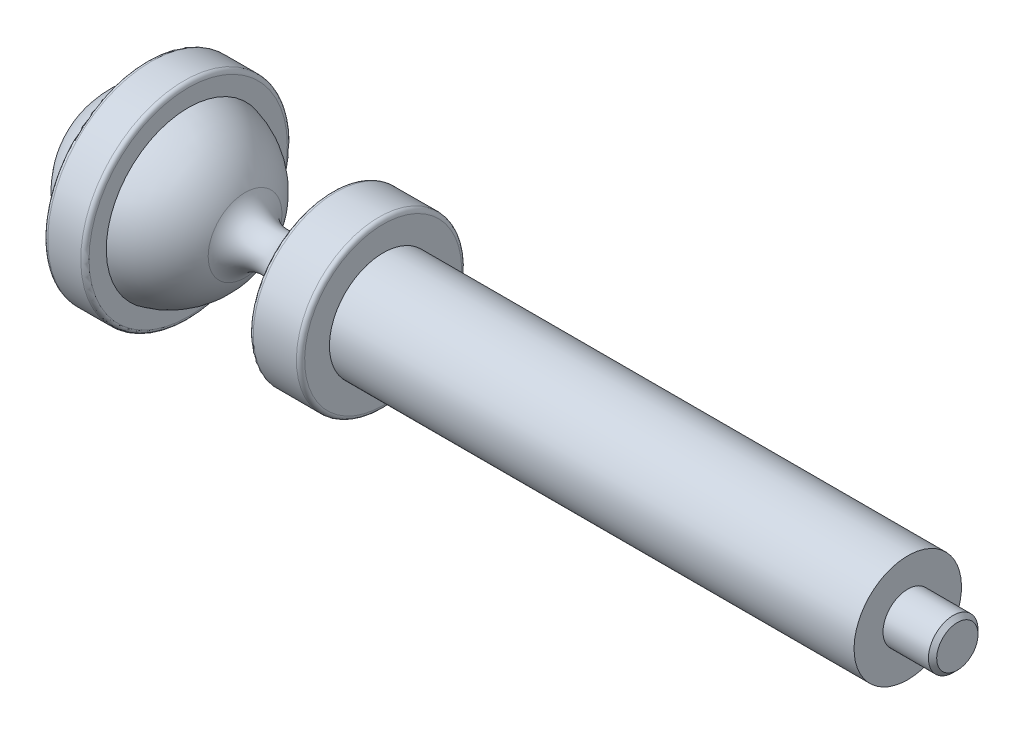
ISO-10303-21;
HEADER;
FILE_DESCRIPTION(('STEP AP214'),'2;1');
FILE_NAME('part.step','',(''),(''),'','','');
FILE_SCHEMA(('AUTOMOTIVE_DESIGN { 1 0 10303 214 1 1 1 1 }'));
ENDSEC;
DATA;
#1=APPLICATION_CONTEXT('core data for automotive mechanical design processes');
#2=APPLICATION_PROTOCOL_DEFINITION('international standard','automotive_design',2000,#1);
#3=PRODUCT_CONTEXT('',#1,'mechanical');
#4=PRODUCT('Part','Part','',(#3));
#5=PRODUCT_RELATED_PRODUCT_CATEGORY('part','',(#4));
#6=PRODUCT_DEFINITION_FORMATION('','',#4);
#7=PRODUCT_DEFINITION_CONTEXT('part definition',#1,'design');
#8=PRODUCT_DEFINITION('design','',#6,#7);
#9=PRODUCT_DEFINITION_SHAPE('','',#8);
#10=(LENGTH_UNIT() NAMED_UNIT(*) SI_UNIT(.MILLI.,.METRE.));
#11=(NAMED_UNIT(*) PLANE_ANGLE_UNIT() SI_UNIT($,.RADIAN.));
#12=(NAMED_UNIT(*) SI_UNIT($,.STERADIAN.) SOLID_ANGLE_UNIT());
#13=UNCERTAINTY_MEASURE_WITH_UNIT(LENGTH_MEASURE(1.E-05),#10,'distance_accuracy_value','');
#14=(GEOMETRIC_REPRESENTATION_CONTEXT(3) GLOBAL_UNCERTAINTY_ASSIGNED_CONTEXT((#13)) GLOBAL_UNIT_ASSIGNED_CONTEXT((#10,
#11,#12)) REPRESENTATION_CONTEXT('',''));
#15=CARTESIAN_POINT('',(0.,0.,0.));
#16=DIRECTION('',(0.,0.,1.));
#17=DIRECTION('',(1.,0.,0.));
#18=AXIS2_PLACEMENT_3D('',#15,#16,#17);
#19=CARTESIAN_POINT('',(10.16,0.,0.));
#20=DIRECTION('',(-1.,0.,0.));
#21=DIRECTION('',(0.,1.,0.));
#22=AXIS2_PLACEMENT_3D('',#19,#20,#21);
#23=SPHERICAL_SURFACE('',#22,10.16);
#24=CARTESIAN_POINT('',(7.4,0.,0.));
#25=DIRECTION('',(-1.,0.,0.));
#26=DIRECTION('',(0.,-1.,0.));
#27=AXIS2_PLACEMENT_3D('',#24,#25,#26);
#28=CIRCLE('',#27,9.77793434218087);
#29=CARTESIAN_POINT('',(7.4,-9.77793434218087,0.));
#30=VERTEX_POINT('',#29);
#31=EDGE_CURVE('E95',#30,#30,#28,.T.);
#32=ORIENTED_EDGE('',*,*,#31,.T.);
#33=EDGE_LOOP('',(#32));
#34=FACE_BOUND('',#33,.T.);
#35=ADVANCED_FACE('F39',(#34),#23,.T.);
#36=CARTESIAN_POINT('',(105.5,0.,0.));
#37=DIRECTION('',(-1.,0.,0.));
#38=DIRECTION('',(0.,-1.,0.));
#39=AXIS2_PLACEMENT_3D('',#36,#37,#38);
#40=PLANE('',#39);
#41=CARTESIAN_POINT('',(105.5,0.,0.));
#42=DIRECTION('',(-1.,0.,0.));
#43=DIRECTION('',(0.,-1.,0.));
#44=AXIS2_PLACEMENT_3D('',#41,#42,#43);
#45=CIRCLE('',#44,2.5);
#46=CARTESIAN_POINT('',(105.5,-2.5,0.));
#47=VERTEX_POINT('',#46);
#48=EDGE_CURVE('E71',#47,#47,#45,.T.);
#49=ORIENTED_EDGE('',*,*,#48,.F.);
#50=EDGE_LOOP('',(#49));
#51=FACE_BOUND('',#50,.T.);
#52=ADVANCED_FACE('F116',(#51),#40,.F.);
#53=CARTESIAN_POINT('',(105.5,0.,0.));
#54=DIRECTION('',(-1.,0.,0.));
#55=DIRECTION('',(0.,-1.,0.));
#56=AXIS2_PLACEMENT_3D('',#53,#54,#55);
#57=CONICAL_SURFACE('',#56,2.5,0.785398163397448);
#58=CARTESIAN_POINT('',(105.,0.,0.));
#59=DIRECTION('',(-1.,0.,0.));
#60=DIRECTION('',(0.,-1.,0.));
#61=AXIS2_PLACEMENT_3D('',#58,#59,#60);
#62=CIRCLE('',#61,3.);
#63=CARTESIAN_POINT('',(105.,-3.,0.));
#64=VERTEX_POINT('',#63);
#65=EDGE_CURVE('E74',#64,#64,#62,.T.);
#66=ORIENTED_EDGE('',*,*,#65,.F.);
#67=EDGE_LOOP('',(#66));
#68=FACE_BOUND('',#67,.T.);
#69=ORIENTED_EDGE('',*,*,#48,.T.);
#70=EDGE_LOOP('',(#69));
#71=FACE_BOUND('',#70,.T.);
#72=ADVANCED_FACE('F121',(#68,#71),#57,.T.);
#73=CARTESIAN_POINT('',(0.,0.,0.));
#74=DIRECTION('',(-1.,0.,0.));
#75=DIRECTION('',(0.,-1.,0.));
#76=AXIS2_PLACEMENT_3D('',#73,#74,#75);
#77=CYLINDRICAL_SURFACE('',#76,3.);
#78=CARTESIAN_POINT('',(99.5,0.,0.));
#79=DIRECTION('',(-1.,0.,0.));
#80=DIRECTION('',(0.,-1.,0.));
#81=AXIS2_PLACEMENT_3D('',#78,#79,#80);
#82=CIRCLE('',#81,3.);
#83=CARTESIAN_POINT('',(99.5,-3.,0.));
#84=VERTEX_POINT('',#83);
#85=EDGE_CURVE('E77',#84,#84,#82,.T.);
#86=ORIENTED_EDGE('',*,*,#85,.F.);
#87=EDGE_LOOP('',(#86));
#88=FACE_BOUND('',#87,.T.);
#89=ORIENTED_EDGE('',*,*,#65,.T.);
#90=EDGE_LOOP('',(#89));
#91=FACE_BOUND('',#90,.T.);
#92=ADVANCED_FACE('F246',(#88,#91),#77,.T.);
#93=CARTESIAN_POINT('',(99.5,3.,0.));
#94=DIRECTION('',(-1.,0.,0.));
#95=DIRECTION('',(0.,-1.,0.));
#96=AXIS2_PLACEMENT_3D('',#93,#94,#95);
#97=PLANE('',#96);
#98=CARTESIAN_POINT('',(99.5,0.,0.));
#99=DIRECTION('',(-1.,0.,0.));
#100=DIRECTION('',(0.,-1.,0.));
#101=AXIS2_PLACEMENT_3D('',#98,#99,#100);
#102=CIRCLE('',#101,6.5);
#103=CARTESIAN_POINT('',(99.5,-6.5,0.));
#104=VERTEX_POINT('',#103);
#105=EDGE_CURVE('E80',#104,#104,#102,.T.);
#106=ORIENTED_EDGE('',*,*,#105,.F.);
#107=EDGE_LOOP('',(#106));
#108=FACE_BOUND('',#107,.T.);
#109=ORIENTED_EDGE('',*,*,#85,.T.);
#110=EDGE_LOOP('',(#109));
#111=FACE_BOUND('',#110,.T.);
#112=ADVANCED_FACE('F236',(#108,#111),#97,.F.);
#113=CARTESIAN_POINT('',(0.,0.,0.));
#114=DIRECTION('',(-1.,0.,0.));
#115=DIRECTION('',(0.,-1.,0.));
#116=AXIS2_PLACEMENT_3D('',#113,#114,#115);
#117=CYLINDRICAL_SURFACE('',#116,6.5);
#118=CARTESIAN_POINT('',(36.,0.,0.));
#119=DIRECTION('',(-1.,0.,0.));
#120=DIRECTION('',(0.,-1.,0.));
#121=AXIS2_PLACEMENT_3D('',#118,#119,#120);
#122=CIRCLE('',#121,6.5);
#123=CARTESIAN_POINT('',(36.,-6.5,0.));
#124=VERTEX_POINT('',#123);
#125=EDGE_CURVE('E83',#124,#124,#122,.T.);
#126=ORIENTED_EDGE('',*,*,#125,.F.);
#127=EDGE_LOOP('',(#126));
#128=FACE_BOUND('',#127,.T.);
#129=ORIENTED_EDGE('',*,*,#105,.T.);
#130=EDGE_LOOP('',(#129));
#131=FACE_BOUND('',#130,.T.);
#132=ADVANCED_FACE('F212',(#128,#131),#117,.T.);
#133=CARTESIAN_POINT('',(36.,6.5,0.));
#134=DIRECTION('',(-1.,0.,0.));
#135=DIRECTION('',(0.,-1.,0.));
#136=AXIS2_PLACEMENT_3D('',#133,#134,#135);
#137=PLANE('',#136);
#138=CARTESIAN_POINT('',(36.,0.,0.));
#139=DIRECTION('',(-1.,0.,0.));
#140=DIRECTION('',(0.,-1.,0.));
#141=AXIS2_PLACEMENT_3D('',#138,#139,#140);
#142=CIRCLE('',#141,9.5);
#143=CARTESIAN_POINT('',(36.,-9.5,0.));
#144=VERTEX_POINT('',#143);
#145=EDGE_CURVE('E62',#144,#144,#142,.F.);
#146=ORIENTED_EDGE('',*,*,#145,.T.);
#147=EDGE_LOOP('',(#146));
#148=FACE_BOUND('',#147,.T.);
#149=ORIENTED_EDGE('',*,*,#125,.T.);
#150=EDGE_LOOP('',(#149));
#151=FACE_BOUND('',#150,.T.);
#152=ADVANCED_FACE('F202',(#148,#151),#137,.F.);
#153=CARTESIAN_POINT('',(0.,0.,0.));
#154=DIRECTION('',(-1.,0.,0.));
#155=DIRECTION('',(0.,-1.,0.));
#156=AXIS2_PLACEMENT_3D('',#153,#154,#155);
#157=CYLINDRICAL_SURFACE('',#156,10.);
#158=CARTESIAN_POINT('',(35.5,0.,0.));
#159=DIRECTION('',(-1.,0.,0.));
#160=DIRECTION('',(0.,-1.,0.));
#161=AXIS2_PLACEMENT_3D('',#158,#159,#160);
#162=CIRCLE('',#161,10.);
#163=CARTESIAN_POINT('',(35.5,-10.,0.));
#164=VERTEX_POINT('',#163);
#165=EDGE_CURVE('E65',#164,#164,#162,.T.);
#166=ORIENTED_EDGE('',*,*,#165,.T.);
#167=EDGE_LOOP('',(#166));
#168=FACE_BOUND('',#167,.T.);
#169=CARTESIAN_POINT('',(30.2754821344869,0.,0.));
#170=DIRECTION('',(1.,0.,0.));
#171=DIRECTION('',(0.,1.,0.));
#172=AXIS2_PLACEMENT_3D('',#169,#170,#171);
#173=CIRCLE('',#172,10.);
#174=CARTESIAN_POINT('',(30.2754821344869,10.,0.));
#175=VERTEX_POINT('',#174);
#176=EDGE_CURVE('E68',#175,#175,#173,.T.);
#177=ORIENTED_EDGE('',*,*,#176,.T.);
#178=EDGE_LOOP('',(#177));
#179=FACE_BOUND('',#178,.T.);
#180=ADVANCED_FACE('F190',(#168,#179),#157,.T.);
#181=CARTESIAN_POINT('',(30.,0.,0.));
#182=DIRECTION('',(1.,0.,0.));
#183=DIRECTION('',(0.,1.,0.));
#184=AXIS2_PLACEMENT_3D('',#181,#182,#183);
#185=CONICAL_SURFACE('',#184,10.,1.00716646228517);
#186=CARTESIAN_POINT('',(29.8528214346647,0.,0.));
#187=DIRECTION('',(-1.,0.,0.));
#188=DIRECTION('',(0.,-1.,0.));
#189=AXIS2_PLACEMENT_3D('',#186,#187,#188);
#190=CIRCLE('',#189,9.76712905649842);
#191=CARTESIAN_POINT('',(29.8528214346647,-9.76712905649842,0.));
#192=VERTEX_POINT('',#191);
#193=EDGE_CURVE('E59',#192,#192,#190,.T.);
#194=ORIENTED_EDGE('',*,*,#193,.T.);
#195=EDGE_LOOP('',(#194));
#196=FACE_BOUND('',#195,.T.);
#197=CARTESIAN_POINT('',(26.2612855985783,0.,0.));
#198=DIRECTION('',(-1.,0.,0.));
#199=DIRECTION('',(0.,-1.,0.));
#200=AXIS2_PLACEMENT_3D('',#197,#198,#199);
#201=CIRCLE('',#200,4.08447861848418);
#202=CARTESIAN_POINT('',(26.2612855985783,-4.08447861848418,0.));
#203=VERTEX_POINT('',#202);
#204=EDGE_CURVE('E86',#203,#203,#201,.T.);
#205=ORIENTED_EDGE('',*,*,#204,.F.);
#206=EDGE_LOOP('',(#205));
#207=FACE_BOUND('',#206,.T.);
#208=ADVANCED_FACE('F184',(#196,#207),#185,.T.);
#209=CARTESIAN_POINT('',(22.88,0.,0.));
#210=DIRECTION('',(-1.,0.,0.));
#211=DIRECTION('',(0.,-1.,0.));
#212=AXIS2_PLACEMENT_3D('',#209,#210,#211);
#213=TOROIDAL_SURFACE('',#212,6.22151107047155,4.);
#214=CARTESIAN_POINT('',(19.2867796610169,0.,0.));
#215=DIRECTION('',(-1.,0.,0.));
#216=DIRECTION('',(0.,-1.,0.));
#217=AXIS2_PLACEMENT_3D('',#214,#215,#216);
#218=CIRCLE('',#217,4.46402206751349);
#219=CARTESIAN_POINT('',(19.286779661017,4.46402206751348,0.));
#220=VERTEX_POINT('',#219);
#221=EDGE_CURVE('E89',#220,#220,#218,.T.);
#222=ORIENTED_EDGE('',*,*,#221,.F.);
#223=EDGE_LOOP('',(#222));
#224=FACE_BOUND('',#223,.T.);
#225=ORIENTED_EDGE('',*,*,#204,.T.);
#226=EDGE_LOOP('',(#225));
#227=FACE_BOUND('',#226,.T.);
#228=ADVANCED_FACE('F189',(#224,#227),#213,.F.);
#229=CARTESIAN_POINT('',(10.16,0.,0.));
#230=DIRECTION('',(-1.,0.,0.));
#231=DIRECTION('',(0.,1.,0.));
#232=AXIS2_PLACEMENT_3D('',#229,#230,#231);
#233=SPHERICAL_SURFACE('',#232,10.16);
#234=CARTESIAN_POINT('',(12.4,0.,0.));
#235=DIRECTION('',(-1.,0.,0.));
#236=DIRECTION('',(0.,-1.,0.));
#237=AXIS2_PLACEMENT_3D('',#234,#235,#236);
#238=CIRCLE('',#237,9.90999495459003);
#239=CARTESIAN_POINT('',(12.4,9.90999495459003,0.));
#240=VERTEX_POINT('',#239);
#241=EDGE_CURVE('E92',#240,#240,#238,.T.);
#242=CARTESIAN_POINT('',(12.4,9.90999495459003,0.));
#243=CARTESIAN_POINT('',(12.492245398935,9.88914469795175,0.));
#244=CARTESIAN_POINT('',(12.5841994943646,9.86700576516309,0.));
#245=CARTESIAN_POINT('',(12.7674537790401,9.82016938355329,0.));
#246=CARTESIAN_POINT('',(12.8587539682859,9.79547193473214,0.));
#247=CARTESIAN_POINT('',(13.040629141421,9.74353735732556,0.));
#248=CARTESIAN_POINT('',(13.1312041253103,9.71630022874013,0.));
#249=CARTESIAN_POINT('',(13.311558290662,9.65930764295145,0.));
#250=CARTESIAN_POINT('',(13.4013374721245,9.62955218574819,0.));
#251=CARTESIAN_POINT('',(13.5800300194723,9.56754611430478,0.));
#252=CARTESIAN_POINT('',(13.6689433853576,9.53529550006463,0.));
#253=CARTESIAN_POINT('',(13.8458349733304,9.4683242701095,0.));
#254=CARTESIAN_POINT('',(13.9338131954179,9.43360365439452,0.));
#255=CARTESIAN_POINT('',(14.1087658941254,9.36171949275429,0.));
#256=CARTESIAN_POINT('',(14.1957403707455,9.32455594682903,0.));
#257=CARTESIAN_POINT('',(14.3686177602243,9.24781490366587,0.));
#258=CARTESIAN_POINT('',(14.4545206730831,9.20823740642794,0.));
#259=CARTESIAN_POINT('',(14.6251879521102,9.12669932107984,0.));
#260=CARTESIAN_POINT('',(14.7099523182784,9.08473873296966,0.));
#261=CARTESIAN_POINT('',(14.8782764088283,8.99846718473297,0.));
#262=CARTESIAN_POINT('',(14.96183613321,8.95415622460646,0.));
#263=CARTESIAN_POINT('',(15.1276857843982,8.86321848384519,0.));
#264=CARTESIAN_POINT('',(15.2099757112048,8.81659170321042,0.));
#265=CARTESIAN_POINT('',(15.3732216015838,8.72105867871844,0.));
#266=CARTESIAN_POINT('',(15.4541775651562,8.67215243486122,0.));
#267=CARTESIAN_POINT('',(15.6146924035662,8.5720986186203,0.));
#268=CARTESIAN_POINT('',(15.6942512784037,8.52095104623658,0.));
#269=CARTESIAN_POINT('',(15.8519099032251,8.41645445531796,0.));
#270=CARTESIAN_POINT('',(15.9300096532089,8.36310543678304,0.));
#271=CARTESIAN_POINT('',(16.0846891299577,8.25424755251709,0.));
#272=CARTESIAN_POINT('',(16.1612688567228,8.19873868678604,0.));
#273=CARTESIAN_POINT('',(16.3128485739093,8.08560439122614,0.));
#274=CARTESIAN_POINT('',(16.3878485643307,8.0279789613973,0.));
#275=CARTESIAN_POINT('',(16.5362103275058,7.91065647113325,0.));
#276=CARTESIAN_POINT('',(16.6095721002594,7.85095941069807,0.));
#277=CARTESIAN_POINT('',(16.7546002241772,7.72954020806903,0.));
#278=CARTESIAN_POINT('',(16.8262665753412,7.66781806587519,0.));
#279=CARTESIAN_POINT('',(16.9678479741646,7.54239682763622,0.));
#280=CARTESIAN_POINT('',(17.0377630218238,7.4786977315911,0.));
#281=CARTESIAN_POINT('',(17.1757872973034,7.3493722550889,0.));
#282=CARTESIAN_POINT('',(17.2438965251236,7.28374587463182,0.));
#283=CARTESIAN_POINT('',(17.3782560526806,7.150617001547,0.));
#284=CARTESIAN_POINT('',(17.4445063524172,7.08311450891927,0.));
#285=CARTESIAN_POINT('',(17.5750963650647,6.94628604663544,0.));
#286=CARTESIAN_POINT('',(17.6394360779754,6.87696007697934,0.));
#287=CARTESIAN_POINT('',(17.7661547480071,6.73653871763745,0.));
#288=CARTESIAN_POINT('',(17.8285337051281,6.66544332795166,0.));
#289=CARTESIAN_POINT('',(17.9512822235312,6.52153856526304,0.));
#290=CARTESIAN_POINT('',(18.0116517848132,6.44872919226021,0.));
#291=CARTESIAN_POINT('',(18.1303344382691,6.30145323610511,0.));
#292=CARTESIAN_POINT('',(18.1886475304429,6.22698665295285,0.));
#293=CARTESIAN_POINT('',(18.3031717761282,6.07645434197272,0.));
#294=CARTESIAN_POINT('',(18.3593829296396,6.00038861414485,0.));
#295=CARTESIAN_POINT('',(18.4696594667596,5.84671732586831,0.));
#296=CARTESIAN_POINT('',(18.5237248503682,5.76911176541964,0.));
#297=CARTESIAN_POINT('',(18.6296676921279,5.61242132596294,0.));
#298=CARTESIAN_POINT('',(18.6815451502789,5.5333364469549,0.));
#299=CARTESIAN_POINT('',(18.7830716822045,5.37374903301307,0.));
#300=CARTESIAN_POINT('',(18.8327207559792,5.29324649807928,0.));
#301=CARTESIAN_POINT('',(18.9297518329038,5.13088655873012,0.));
#302=CARTESIAN_POINT('',(18.9771338360537,5.04902915431475,0.));
#303=CARTESIAN_POINT('',(19.0695937222918,4.88402325026839,0.));
#304=CARTESIAN_POINT('',(19.1146716053801,4.8008747506374,0.));
#305=CARTESIAN_POINT('',(19.2024884873698,4.63335169332348,0.));
#306=CARTESIAN_POINT('',(19.2452274862713,4.54897713564055,0.));
#307=CARTESIAN_POINT('',(19.286779661017,4.46402206751348,0.));
#308=B_SPLINE_CURVE_WITH_KNOTS('',3,(#242,#243,#244,#245,#246,#247,#248,#249,#250,#251,#252,
#253,#254,#255,#256,#257,#258,#259,#260,#261,#262,#263,#264,#265,#266,#267,#268,#269,#270,#271,
#272,#273,#274,#275,#276,#277,#278,#279,#280,#281,#282,#283,#284,#285,#286,#287,#288,#289,#290,
#291,#292,#293,#294,#295,#296,#297,#298,#299,#300,#301,#302,#303,#304,#305,#306,#307),
.UNSPECIFIED.,.F.,.F.,(4,2,2,2,2,2,2,2,2,2,2,2,2,2,2,2,2,2,2,2,2,2,2,2,2,2,2,2,2,2,2,2,4),(0.,
0.283708078249063,0.567416156498129,0.851124234747192,1.13483231299626,1.41854039124532,
1.70224846949438,1.98595654774345,2.26966462599251,2.55337270424158,2.83708078249064,
3.12078886073971,3.40449693898877,3.68820501723783,3.9719130954869,4.25562117373596,
4.53932925198503,4.82303733023409,5.10674540848315,5.39045348673222,5.67416156498128,
5.95786964323035,6.24157772147941,6.52528579972847,6.80899387797754,7.0927019562266,
7.37641003447567,7.66011811272473,7.9438261909738,8.22753426922286,8.51124234747193,
8.79495042572099,9.07865850397005),.UNSPECIFIED.);
#309=EDGE_CURVE('BSEAM177',#240,#220,#308,.T.);
#310=ORIENTED_EDGE('',*,*,#241,.F.);
#311=ORIENTED_EDGE('',*,*,#221,.T.);
#312=ORIENTED_EDGE('',*,*,#309,.T.);
#313=ORIENTED_EDGE('',*,*,#309,.F.);
#314=EDGE_LOOP('',(#310,#312,#311,#313));
#315=FACE_BOUND('',#314,.T.);
#316=ADVANCED_FACE('F177',(#315),#233,.T.);
#317=CARTESIAN_POINT('',(12.4,12.5,0.));
#318=DIRECTION('',(-1.,0.,0.));
#319=DIRECTION('',(0.,-1.,0.));
#320=AXIS2_PLACEMENT_3D('',#317,#318,#319);
#321=PLANE('',#320);
#322=CARTESIAN_POINT('',(12.4,0.,0.));
#323=DIRECTION('',(-1.,0.,0.));
#324=DIRECTION('',(0.,-1.,0.));
#325=AXIS2_PLACEMENT_3D('',#322,#323,#324);
#326=CIRCLE('',#325,12.);
#327=CARTESIAN_POINT('',(12.4,-12.,0.));
#328=VERTEX_POINT('',#327);
#329=EDGE_CURVE('E46',#328,#328,#326,.F.);
#330=ORIENTED_EDGE('',*,*,#329,.T.);
#331=EDGE_LOOP('',(#330));
#332=FACE_BOUND('',#331,.T.);
#333=ORIENTED_EDGE('',*,*,#241,.T.);
#334=EDGE_LOOP('',(#333));
#335=FACE_BOUND('',#334,.T.);
#336=ADVANCED_FACE('F112',(#332,#335),#321,.F.);
#337=CARTESIAN_POINT('',(0.,0.,0.));
#338=DIRECTION('',(-1.,0.,0.));
#339=DIRECTION('',(0.,-1.,0.));
#340=AXIS2_PLACEMENT_3D('',#337,#338,#339);
#341=CYLINDRICAL_SURFACE('',#340,12.5);
#342=CARTESIAN_POINT('',(11.9,0.,0.));
#343=DIRECTION('',(-1.,0.,0.));
#344=DIRECTION('',(0.,-1.,0.));
#345=AXIS2_PLACEMENT_3D('',#342,#343,#344);
#346=CIRCLE('',#345,12.5);
#347=CARTESIAN_POINT('',(11.9,-12.5,0.));
#348=VERTEX_POINT('',#347);
#349=EDGE_CURVE('E50',#348,#348,#346,.T.);
#350=ORIENTED_EDGE('',*,*,#349,.T.);
#351=EDGE_LOOP('',(#350));
#352=FACE_BOUND('',#351,.T.);
#353=CARTESIAN_POINT('',(7.9,0.,0.));
#354=DIRECTION('',(1.,0.,0.));
#355=DIRECTION('',(0.,1.,0.));
#356=AXIS2_PLACEMENT_3D('',#353,#354,#355);
#357=CIRCLE('',#356,12.5);
#358=CARTESIAN_POINT('',(7.9,12.5,0.));
#359=VERTEX_POINT('',#358);
#360=EDGE_CURVE('E54',#359,#359,#357,.T.);
#361=ORIENTED_EDGE('',*,*,#360,.T.);
#362=EDGE_LOOP('',(#361));
#363=FACE_BOUND('',#362,.T.);
#364=ADVANCED_FACE('F103',(#352,#363),#341,.T.);
#365=CARTESIAN_POINT('',(7.4,9.77793434218087,0.));
#366=DIRECTION('',(1.,0.,0.));
#367=DIRECTION('',(0.,1.,0.));
#368=AXIS2_PLACEMENT_3D('',#365,#366,#367);
#369=PLANE('',#368);
#370=CARTESIAN_POINT('',(7.4,0.,0.));
#371=DIRECTION('',(1.,0.,0.));
#372=DIRECTION('',(0.,1.,0.));
#373=AXIS2_PLACEMENT_3D('',#370,#371,#372);
#374=CIRCLE('',#373,12.);
#375=CARTESIAN_POINT('',(7.4,12.,0.));
#376=VERTEX_POINT('',#375);
#377=EDGE_CURVE('E10',#376,#376,#374,.F.);
#378=ORIENTED_EDGE('',*,*,#377,.T.);
#379=EDGE_LOOP('',(#378));
#380=FACE_BOUND('',#379,.T.);
#381=ORIENTED_EDGE('',*,*,#31,.F.);
#382=EDGE_LOOP('',(#381));
#383=FACE_BOUND('',#382,.T.);
#384=ADVANCED_FACE('F100',(#380,#383),#369,.F.);
#385=CARTESIAN_POINT('',(35.5,0.,0.));
#386=DIRECTION('',(-1.,0.,0.));
#387=DIRECTION('',(0.,-1.,0.));
#388=AXIS2_PLACEMENT_3D('',#385,#386,#387);
#389=TOROIDAL_SURFACE('',#388,9.5,0.5);
#390=ORIENTED_EDGE('',*,*,#145,.F.);
#391=EDGE_LOOP('',(#390));
#392=FACE_BOUND('',#391,.T.);
#393=ORIENTED_EDGE('',*,*,#165,.F.);
#394=EDGE_LOOP('',(#393));
#395=FACE_BOUND('',#394,.T.);
#396=ADVANCED_FACE('F102',(#392,#395),#389,.T.);
#397=CARTESIAN_POINT('',(30.2754821344869,0.,0.));
#398=DIRECTION('',(1.,0.,0.));
#399=DIRECTION('',(0.,1.,0.));
#400=AXIS2_PLACEMENT_3D('',#397,#398,#399);
#401=TOROIDAL_SURFACE('',#400,9.5,0.5);
#402=ORIENTED_EDGE('',*,*,#176,.F.);
#403=EDGE_LOOP('',(#402));
#404=FACE_BOUND('',#403,.T.);
#405=ORIENTED_EDGE('',*,*,#193,.F.);
#406=EDGE_LOOP('',(#405));
#407=FACE_BOUND('',#406,.T.);
#408=ADVANCED_FACE('F109',(#404,#407),#401,.T.);
#409=CARTESIAN_POINT('',(11.9,0.,0.));
#410=DIRECTION('',(-1.,0.,0.));
#411=DIRECTION('',(0.,-1.,0.));
#412=AXIS2_PLACEMENT_3D('',#409,#410,#411);
#413=TOROIDAL_SURFACE('',#412,12.,0.5);
#414=ORIENTED_EDGE('',*,*,#329,.F.);
#415=EDGE_LOOP('',(#414));
#416=FACE_BOUND('',#415,.T.);
#417=ORIENTED_EDGE('',*,*,#349,.F.);
#418=EDGE_LOOP('',(#417));
#419=FACE_BOUND('',#418,.T.);
#420=ADVANCED_FACE('F127',(#416,#419),#413,.T.);
#421=CARTESIAN_POINT('',(7.9,0.,0.));
#422=DIRECTION('',(1.,0.,0.));
#423=DIRECTION('',(0.,1.,0.));
#424=AXIS2_PLACEMENT_3D('',#421,#422,#423);
#425=TOROIDAL_SURFACE('',#424,12.,0.5);
#426=ORIENTED_EDGE('',*,*,#360,.F.);
#427=EDGE_LOOP('',(#426));
#428=FACE_BOUND('',#427,.T.);
#429=ORIENTED_EDGE('',*,*,#377,.F.);
#430=EDGE_LOOP('',(#429));
#431=FACE_BOUND('',#430,.T.);
#432=ADVANCED_FACE('F41',(#428,#431),#425,.T.);
#433=CLOSED_SHELL('',(#35,#52,#72,#92,#112,#132,#152,#180,#208,#228,#316,#336,#364,#384,#396,
#408,#420,#432));
#434=MANIFOLD_SOLID_BREP('B2',#433);
#435=ADVANCED_BREP_SHAPE_REPRESENTATION('',(#18,#434),#14);
#436=SHAPE_DEFINITION_REPRESENTATION(#9,#435);
ENDSEC;
END-ISO-10303-21;
